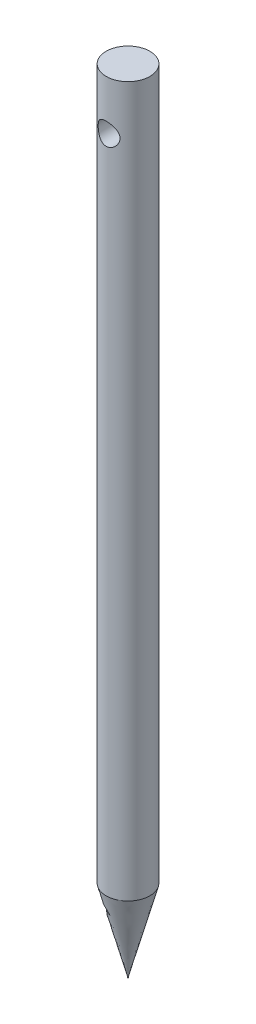
ISO-10303-21;
HEADER;
FILE_DESCRIPTION(('STEP AP214'),'2;1');
FILE_NAME('part.step','',(''),(''),'','','');
FILE_SCHEMA(('AUTOMOTIVE_DESIGN { 1 0 10303 214 1 1 1 1 }'));
ENDSEC;
DATA;
#1=APPLICATION_CONTEXT('core data for automotive mechanical design processes');
#2=APPLICATION_PROTOCOL_DEFINITION('international standard','automotive_design',2000,#1);
#3=PRODUCT_CONTEXT('',#1,'mechanical');
#4=PRODUCT('Part','Part','',(#3));
#5=PRODUCT_RELATED_PRODUCT_CATEGORY('part','',(#4));
#6=PRODUCT_DEFINITION_FORMATION('','',#4);
#7=PRODUCT_DEFINITION_CONTEXT('part definition',#1,'design');
#8=PRODUCT_DEFINITION('design','',#6,#7);
#9=PRODUCT_DEFINITION_SHAPE('','',#8);
#10=(LENGTH_UNIT() NAMED_UNIT(*) SI_UNIT(.MILLI.,.METRE.));
#11=(NAMED_UNIT(*) PLANE_ANGLE_UNIT() SI_UNIT($,.RADIAN.));
#12=(NAMED_UNIT(*) SI_UNIT($,.STERADIAN.) SOLID_ANGLE_UNIT());
#13=UNCERTAINTY_MEASURE_WITH_UNIT(LENGTH_MEASURE(1.E-05),#10,'distance_accuracy_value','');
#14=(GEOMETRIC_REPRESENTATION_CONTEXT(3) GLOBAL_UNCERTAINTY_ASSIGNED_CONTEXT((#13)) GLOBAL_UNIT_ASSIGNED_CONTEXT((#10,
#11,#12)) REPRESENTATION_CONTEXT('',''));
#15=CARTESIAN_POINT('',(0.,0.,0.));
#16=DIRECTION('',(0.,0.,1.));
#17=DIRECTION('',(1.,0.,0.));
#18=AXIS2_PLACEMENT_3D('',#15,#16,#17);
#19=CARTESIAN_POINT('',(0.,129.988767867344,0.));
#20=DIRECTION('',(0.,-1.,0.));
#21=DIRECTION('',(0.,0.,-1.));
#22=AXIS2_PLACEMENT_3D('',#19,#20,#21);
#23=CYLINDRICAL_SURFACE('',#22,4.);
#24=CARTESIAN_POINT('',(0.,122.894404614433,-4.));
#25=CARTESIAN_POINT('',(-0.105143925902467,122.894398009799,-3.99999426810082));
#26=CARTESIAN_POINT('',(-0.210413199395125,122.886064468191,-3.99580982039513));
#27=CARTESIAN_POINT('',(-0.417840470537792,122.85309885375,-3.97948312074314));
#28=CARTESIAN_POINT('',(-0.519992173427258,122.828435828437,-3.96732575657839));
#29=CARTESIAN_POINT('',(-0.717867089760897,122.7640169972,-3.93632558806751));
#30=CARTESIAN_POINT('',(-0.813613605878293,122.724319845937,-3.91750878355075));
#31=CARTESIAN_POINT('',(-0.996945233613197,122.631263371703,-3.87491553031523));
#32=CARTESIAN_POINT('',(-1.08453098798012,122.577905125935,-3.85113947267051));
#33=CARTESIAN_POINT('',(-1.25501563552382,122.455370115462,-3.79912516516124));
#34=CARTESIAN_POINT('',(-1.33731042224422,122.385431655954,-3.77070398255074));
#35=CARTESIAN_POINT('',(-1.48955888973397,122.233361655939,-3.71319940493486));
#36=CARTESIAN_POINT('',(-1.55950316621354,122.151220910888,-3.68411552418069));
#37=CARTESIAN_POINT('',(-1.69050400090056,121.969437915386,-3.62597902394695));
#38=CARTESIAN_POINT('',(-1.75045067110328,121.868932417741,-3.59710373940264));
#39=CARTESIAN_POINT('',(-1.85233645378139,121.657669942461,-3.54571957544641));
#40=CARTESIAN_POINT('',(-1.89428842993267,121.546920356987,-3.52320615213979));
#41=CARTESIAN_POINT('',(-1.95626488437718,121.325074403589,-3.48915734075617));
#42=CARTESIAN_POINT('',(-1.97745171416088,121.214395710298,-3.47704543167427));
#43=CARTESIAN_POINT('',(-2.00085398661769,120.990446938874,-3.46363779897055));
#44=CARTESIAN_POINT('',(-2.00308817674615,120.877179532691,-3.46233138686576));
#45=CARTESIAN_POINT('',(-1.98937457434459,120.665832565802,-3.47021860514497));
#46=CARTESIAN_POINT('',(-1.97556911907365,120.567556551987,-3.47817527324027));
#47=CARTESIAN_POINT('',(-1.93387969811387,120.374960795687,-3.501524574677));
#48=CARTESIAN_POINT('',(-1.9059912477953,120.280642323822,-3.51691957663553));
#49=CARTESIAN_POINT('',(-1.83641956077201,120.095946349302,-3.55374952825482));
#50=CARTESIAN_POINT('',(-1.79443013423199,120.005711816861,-3.57531681327997));
#51=CARTESIAN_POINT('',(-1.69808337533601,119.833136029253,-3.62206808562807));
#52=CARTESIAN_POINT('',(-1.64372048762494,119.750798343233,-3.64725369560381));
#53=CARTESIAN_POINT('',(-1.51613210982558,119.585362108947,-3.70226315806572));
#54=CARTESIAN_POINT('',(-1.44138891673857,119.503490867281,-3.73227020473492));
#55=CARTESIAN_POINT('',(-1.27911115748275,119.352933777251,-3.79095246600814));
#56=CARTESIAN_POINT('',(-1.19157051314857,119.284254230365,-3.81962703917602));
#57=CARTESIAN_POINT('',(-1.0010330116637,119.159033292374,-3.87403974565928));
#58=CARTESIAN_POINT('',(-0.897507183198821,119.103203669542,-3.89957968324014));
#59=CARTESIAN_POINT('',(-0.680932430977601,119.010210556347,-3.94315762242484));
#60=CARTESIAN_POINT('',(-0.567891152530564,118.973032244403,-3.96120157887106));
#61=CARTESIAN_POINT('',(-0.345532983321419,118.921453807,-3.98648667482871));
#62=CARTESIAN_POINT('',(-0.236683061096666,118.905422142939,-3.9944987660262));
#63=CARTESIAN_POINT('',(-0.0175591998987147,118.891475152164,-4.00146026918207));
#64=CARTESIAN_POINT('',(0.0927140397398067,118.893551243154,-4.00041397442637));
#65=CARTESIAN_POINT('',(0.302465943971962,118.91481799127,-3.9898238450687));
#66=CARTESIAN_POINT('',(0.402118816099847,118.932669679893,-3.98094491376337));
#67=CARTESIAN_POINT('',(0.59681378460387,118.982880758223,-3.95644342629681));
#68=CARTESIAN_POINT('',(0.691855371382165,119.01524174734,-3.94082012668824));
#69=CARTESIAN_POINT('',(0.877777216899138,119.094401547299,-3.90368502827176));
#70=CARTESIAN_POINT('',(0.968460794011598,119.141586714666,-3.88201763539262));
#71=CARTESIAN_POINT('',(1.14092272339854,119.248619685726,-3.83487948634835));
#72=CARTESIAN_POINT('',(1.22269725955318,119.308472883624,-3.80940711133877));
#73=CARTESIAN_POINT('',(1.38353537857843,119.445925465094,-3.75416442672396));
#74=CARTESIAN_POINT('',(1.46154415563805,119.524690351323,-3.72421769686999));
#75=CARTESIAN_POINT('',(1.60371264223771,119.694254916988,-3.6652478321764));
#76=CARTESIAN_POINT('',(1.66786277142374,119.785062852129,-3.63622534800094));
#77=CARTESIAN_POINT('',(1.78341582895803,119.981691922779,-3.58102384412979));
#78=CARTESIAN_POINT('',(1.83405099160049,120.088027146622,-3.55505059178121));
#79=CARTESIAN_POINT('',(1.91616565186941,120.309424749583,-3.51148144588269));
#80=CARTESIAN_POINT('',(1.94766983173403,120.424475667367,-3.493874764435));
#81=CARTESIAN_POINT('',(1.98772337493374,120.648225060202,-3.47123002051604));
#82=CARTESIAN_POINT('',(1.9981859928109,120.756473121303,-3.4651476693013));
#83=CARTESIAN_POINT('',(2.0013783087524,120.973298748762,-3.46330709283206));
#84=CARTESIAN_POINT('',(1.99411569324648,121.081876151909,-3.4675443925278));
#85=CARTESIAN_POINT('',(1.96385225118662,121.2853716175,-3.48475724102153));
#86=CARTESIAN_POINT('',(1.94241662868607,121.380605554722,-3.49686188965317));
#87=CARTESIAN_POINT('',(1.88635071644883,121.566020853282,-3.52742032375305));
#88=CARTESIAN_POINT('',(1.85171618231985,121.656200578617,-3.54587615139336));
#89=CARTESIAN_POINT('',(1.76763149060114,121.835654316406,-3.58857060729071));
#90=CARTESIAN_POINT('',(1.71734227563141,121.924460418091,-3.61311444791841));
#91=CARTESIAN_POINT('',(1.60430194327479,122.092953686795,-3.6647066326972));
#92=CARTESIAN_POINT('',(1.54154434248313,122.172636075475,-3.69175627591221));
#93=CARTESIAN_POINT('',(1.39640665332275,122.330688579142,-3.74924646316184));
#94=CARTESIAN_POINT('',(1.31256884599452,122.407722819134,-3.77969966613256));
#95=CARTESIAN_POINT('',(1.13230961246639,122.546930581304,-3.83755504519861));
#96=CARTESIAN_POINT('',(1.0358814466104,122.609096093373,-3.8649555725239));
#97=CARTESIAN_POINT('',(0.831863193565896,122.716877339857,-3.91396019133074));
#98=CARTESIAN_POINT('',(0.724199007553465,122.762372952906,-3.93552192987866));
#99=CARTESIAN_POINT('',(0.501484202276178,122.834020949948,-3.97002682597974));
#100=CARTESIAN_POINT('',(0.386455599178206,122.860228308044,-3.98299446726136));
#101=CARTESIAN_POINT('',(0.225203892981795,122.882199436604,-3.99390923826956));
#102=CARTESIAN_POINT('',(0.180323758883133,122.886769896166,-3.99618730680502));
#103=CARTESIAN_POINT('',(0.0903034636101847,122.892873945461,-3.99923393953631));
#104=CARTESIAN_POINT('',(0.0451632952932577,122.894407451373,-4.00000246206762));
#105=CARTESIAN_POINT('',(0.,122.894404614433,-4.));
#106=B_SPLINE_CURVE_WITH_KNOTS('',3,(#24,#25,#26,#27,#28,#29,#30,#31,#32,#33,#34,#35,#36,#37,
#38,#39,#40,#41,#42,#43,#44,#45,#46,#47,#48,#49,#50,#51,#52,#53,#54,#55,#56,#57,#58,#59,#60,#61,
#62,#63,#64,#65,#66,#67,#68,#69,#70,#71,#72,#73,#74,#75,#76,#77,#78,#79,#80,#81,#82,#83,#84,#85,
#86,#87,#88,#89,#90,#91,#92,#93,#94,#95,#96,#97,#98,#99,#100,#101,#102,#103,#104,#105),
.UNSPECIFIED.,.T.,.F.,(4,2,2,2,2,2,2,2,2,2,2,2,2,2,2,2,2,2,2,2,2,2,2,2,2,2,2,2,2,2,2,2,2,2,2,2,
2,2,2,2,4),(0.,0.315248514840584,0.631096299418395,0.945724310984596,1.26032752116313,
1.59396351743619,1.92785247530807,2.28763452861505,2.64715895796562,2.98516024280458,
3.32282714658039,3.62011424818642,3.91749607851357,4.22180480336974,4.52625042520444,
4.86929882667757,5.21251069197373,5.57166044428881,5.93052433824558,6.2596658094269,
6.58865129022951,6.89213813012242,7.19565843261862,7.50785712055796,7.82018901496678,
8.16319221288838,8.50643177230863,8.86629364323451,9.225690238909,9.55058615006094,
9.87534119729356,10.1691586049771,10.463070575767,10.7767291356057,11.0905512228726,
11.4425048551434,11.7946476676249,12.1492802732705,12.502898172423,12.6383056026783,
12.7737167702213),.UNSPECIFIED.);
#107=CARTESIAN_POINT('',(0.,122.894404614433,-4.));
#108=VERTEX_POINT('',#107);
#109=EDGE_CURVE('E44',#108,#108,#106,.T.);
#110=ORIENTED_EDGE('',*,*,#109,.T.);
#111=EDGE_LOOP('',(#110));
#112=FACE_BOUND('',#111,.T.);
#113=CARTESIAN_POINT('',(2.,120.894404614433,3.46410161513775));
#114=CARTESIAN_POINT('',(1.99999158748781,120.790191408959,3.46411185715888));
#115=CARTESIAN_POINT('',(1.99179963610437,120.685842437899,3.46887633544978));
#116=CARTESIAN_POINT('',(1.95944672580053,120.480349437202,3.48724701669072));
#117=CARTESIAN_POINT('',(1.93525221095662,120.379212611185,3.50087179788183));
#118=CARTESIAN_POINT('',(1.8721998159803,120.183501457986,3.53498701490001));
#119=CARTESIAN_POINT('',(1.83341988295963,120.088895355584,3.55544089069169));
#120=CARTESIAN_POINT('',(1.74253507245138,119.907556163957,3.60085327291133));
#121=CARTESIAN_POINT('',(1.69042947410139,119.820823500996,3.62581202301253));
#122=CARTESIAN_POINT('',(1.569333074538,119.6497931713,3.67993738819289));
#123=CARTESIAN_POINT('',(1.49930407053533,119.566286346841,3.70928127465103));
#124=CARTESIAN_POINT('',(1.34650761698202,119.411587833862,3.76743965382121));
#125=CARTESIAN_POINT('',(1.26373385204841,119.340402288229,3.79625387610258));
#126=CARTESIAN_POINT('',(1.08097912631265,119.207670313244,3.85242953961661));
#127=CARTESIAN_POINT('',(0.980214377887148,119.14709707901,3.87956212851245));
#128=CARTESIAN_POINT('',(0.76831405333691,119.044122907646,3.92701512184167));
#129=CARTESIAN_POINT('',(0.65718507631198,119.001710502082,3.94733982363631));
#130=CARTESIAN_POINT('',(0.436089887818815,118.939395291902,3.97760922492053));
#131=CARTESIAN_POINT('',(0.326603580968784,118.918105561741,3.9881896044274));
#132=CARTESIAN_POINT('',(0.10514125740454,118.894072377064,4.00015167691179));
#133=CARTESIAN_POINT('',(-0.00683321168520671,118.891317700837,4.00153893568935));
#134=CARTESIAN_POINT('',(-0.219665048849571,118.903897962378,3.99525963833124));
#135=CARTESIAN_POINT('',(-0.320642398354137,118.917680645477,3.98836991784381));
#136=CARTESIAN_POINT('',(-0.518627543836087,118.960166302241,3.96748490519435));
#137=CARTESIAN_POINT('',(-0.6156350421877,118.988870392385,3.95348908132771));
#138=CARTESIAN_POINT('',(-0.804618783139259,119.060569746613,3.91943166575325));
#139=CARTESIAN_POINT('',(-0.896506847030398,119.103757240777,3.89928883058403));
#140=CARTESIAN_POINT('',(-1.07195360302662,119.202931446836,3.8547529197337));
#141=CARTESIAN_POINT('',(-1.15550929767728,119.258922741038,3.83035832314967));
#142=CARTESIAN_POINT('',(-1.3203473217964,119.388195317499,3.7768878879846));
#143=CARTESIAN_POINT('',(-1.40066815005873,119.462610671085,3.7475875199635));
#144=CARTESIAN_POINT('',(-1.54820874059556,119.623584064293,3.68908681173623));
#145=CARTESIAN_POINT('',(-1.61541842314846,119.710151358981,3.65988656531258));
#146=CARTESIAN_POINT('',(-1.73901066928442,119.899700999281,3.6028831218497));
#147=CARTESIAN_POINT('',(-1.7944346299561,120.003376660541,3.57528639981415));
#148=CARTESIAN_POINT('',(-1.88663822600246,120.220279957151,3.52750900557152));
#149=CARTESIAN_POINT('',(-1.92343731642178,120.333497480468,3.50732060092135));
#150=CARTESIAN_POINT('',(-1.97436042205008,120.556833636999,3.47889271634069));
#151=CARTESIAN_POINT('',(-1.99005024423995,120.66648685252,3.46983311696993));
#152=CARTESIAN_POINT('',(-2.00303389322285,120.887207297466,3.46235838723219));
#153=CARTESIAN_POINT('',(-2.00034071463005,120.998273472673,3.46393573778623));
#154=CARTESIAN_POINT('',(-1.97807208668793,121.20571245159,3.4766867308117));
#155=CARTESIAN_POINT('',(-1.96037563342493,121.302363516649,3.48679175013308));
#156=CARTESIAN_POINT('',(-1.91139256926489,121.491140186975,3.51388043102682));
#157=CARTESIAN_POINT('',(-1.88010155724726,121.583264315926,3.53086632010068));
#158=CARTESIAN_POINT('',(-1.80329517720973,121.765227276238,3.57072444159313));
#159=CARTESIAN_POINT('',(-1.7571881273853,121.854762648139,3.59383286486125));
#160=CARTESIAN_POINT('',(-1.65257412803176,122.025343157512,3.643122389945));
#161=CARTESIAN_POINT('',(-1.59406080866499,122.106383901464,3.66930506710298));
#162=CARTESIAN_POINT('',(-1.45767433439708,122.268362149476,3.72575996912669));
#163=CARTESIAN_POINT('',(-1.37829054462746,122.347998915851,3.75613166308566));
#164=CARTESIAN_POINT('',(-1.20680899079902,122.493229090438,3.81468469955797));
#165=CARTESIAN_POINT('',(-1.1147069493199,122.55881775496,3.84286530015464));
#166=CARTESIAN_POINT('',(-0.917070725108053,122.675552066266,3.89482723381868));
#167=CARTESIAN_POINT('',(-0.81124619511249,122.7262708506,3.91847283343884));
#168=CARTESIAN_POINT('',(-0.591044729317862,122.808680422403,3.95766709918776));
#169=CARTESIAN_POINT('',(-0.47667540291765,122.840387918117,3.97322287353397));
#170=CARTESIAN_POINT('',(-0.253959364539763,122.881141741918,3.99335016363174));
#171=CARTESIAN_POINT('',(-0.1460228872683,122.892000363097,3.9987985581427));
#172=CARTESIAN_POINT('',(0.070251971469944,122.896091148429,4.00084260752374));
#173=CARTESIAN_POINT('',(0.178590198981612,122.889329482962,3.99744136141634));
#174=CARTESIAN_POINT('',(0.385075986136855,122.859571790117,3.98267937668509));
#175=CARTESIAN_POINT('',(0.483424641057412,122.837674877124,3.97185789309443));
#176=CARTESIAN_POINT('',(0.674891898931558,122.779750654626,3.94384187353387));
#177=CARTESIAN_POINT('',(0.768009749669768,122.743721318726,3.92664642364424));
#178=CARTESIAN_POINT('',(0.950846833596738,122.656950359442,3.88651861393181));
#179=CARTESIAN_POINT('',(1.04025036572289,122.605645394681,3.86337234005404));
#180=CARTESIAN_POINT('',(1.20954920326828,122.490489326315,3.81376266676027));
#181=CARTESIAN_POINT('',(1.28944011444318,122.426632460331,3.78729774583428));
#182=CARTESIAN_POINT('',(1.44582833859495,122.280807978874,3.73057218840582));
#183=CARTESIAN_POINT('',(1.52119665879199,122.197670433633,3.70019591726075));
#184=CARTESIAN_POINT('',(1.65732528394006,122.019512386127,3.64126158628571));
#185=CARTESIAN_POINT('',(1.71807266521244,121.924481483072,3.61270515130784));
#186=CARTESIAN_POINT('',(1.82486714716811,121.721095720303,3.55999186256751));
#187=CARTESIAN_POINT('',(1.87038902381914,121.612414703698,3.53600256268535));
#188=CARTESIAN_POINT('',(1.92395929504801,121.443826494802,3.5069621813237));
#189=CARTESIAN_POINT('',(1.93935666147967,121.386756793842,3.49844389329401));
#190=CARTESIAN_POINT('',(1.96508069805043,121.271172056933,3.48406059323535));
#191=CARTESIAN_POINT('',(1.97541091343283,121.212658061679,3.47819372636051));
#192=CARTESIAN_POINT('',(1.9887293296122,121.110803825186,3.47059023668758));
#193=CARTESIAN_POINT('',(1.99295091983786,121.067671557183,3.46816389731816));
#194=CARTESIAN_POINT('',(1.99858810035606,120.98116892134,3.46491740045177));
#195=CARTESIAN_POINT('',(2.00000350293331,120.937798537766,3.46409735040492));
#196=CARTESIAN_POINT('',(2.,120.894404614433,3.46410161513775));
#197=B_SPLINE_CURVE_WITH_KNOTS('',3,(#113,#114,#115,#116,#117,#118,#119,#120,#121,#122,#123,
#124,#125,#126,#127,#128,#129,#130,#131,#132,#133,#134,#135,#136,#137,#138,#139,#140,#141,#142,
#143,#144,#145,#146,#147,#148,#149,#150,#151,#152,#153,#154,#155,#156,#157,#158,#159,#160,#161,
#162,#163,#164,#165,#166,#167,#168,#169,#170,#171,#172,#173,#174,#175,#176,#177,#178,#179,#180,
#181,#182,#183,#184,#185,#186,#187,#188,#189,#190,#191,#192,#193,#194,#195,#196),.UNSPECIFIED.,
.T.,.F.,(4,2,2,2,2,2,2,2,2,2,2,2,2,2,2,2,2,2,2,2,2,2,2,2,2,2,2,2,2,2,2,2,2,2,2,2,2,2,2,2,2,4),
(0.,0.312464245189433,0.62558578564961,0.937057191861541,1.24854545093096,1.58572462503713,
1.92307142172809,2.28315784481594,2.64301653931849,2.97726969939937,3.31132047376146,
3.61632194973143,3.92134625038977,4.2305906946636,4.53994598704611,4.87854382917848,
5.21740096495904,5.57777683462963,5.93777548427476,6.26924581712489,6.60048186380811,
6.89548366852118,7.19058104876194,7.49934592816241,7.80826972444162,8.15613487165295,
8.50411729960472,8.86128362829999,9.2181355962161,9.54224540783041,9.8662417359201,
10.1688884974705,10.4715786702809,10.7872150144301,11.102996602055,11.450204837042,
11.7977188569437,12.1562149808128,12.3351395323571,12.5139387197526,12.6440387634036,
12.7741475095882),.UNSPECIFIED.);
#198=CARTESIAN_POINT('',(2.,120.894404614433,3.46410161513775));
#199=VERTEX_POINT('',#198);
#200=EDGE_CURVE('E64',#199,#199,#197,.T.);
#201=ORIENTED_EDGE('',*,*,#200,.T.);
#202=EDGE_LOOP('',(#201));
#203=FACE_BOUND('',#202,.T.);
#204=CARTESIAN_POINT('',(0.,129.988767867344,0.));
#205=DIRECTION('',(0.,1.,0.));
#206=DIRECTION('',(0.,0.,1.));
#207=AXIS2_PLACEMENT_3D('',#204,#205,#206);
#208=CIRCLE('',#207,4.);
#209=CARTESIAN_POINT('',(0.,129.988767867344,4.));
#210=VERTEX_POINT('',#209);
#211=EDGE_CURVE('E11',#210,#210,#208,.T.);
#212=ORIENTED_EDGE('',*,*,#211,.F.);
#213=EDGE_LOOP('',(#212));
#214=FACE_BOUND('',#213,.T.);
#215=CARTESIAN_POINT('',(0.,0.,0.));
#216=DIRECTION('',(0.,1.,0.));
#217=DIRECTION('',(0.,0.,1.));
#218=AXIS2_PLACEMENT_3D('',#215,#216,#217);
#219=CIRCLE('',#218,4.);
#220=CARTESIAN_POINT('',(3.96556039885036,0.,0.523765904837037));
#221=VERTEX_POINT('',#220);
#222=EDGE_CURVE('E53',#221,#221,#219,.F.);
#223=ORIENTED_EDGE('',*,*,#222,.F.);
#224=EDGE_LOOP('',(#223));
#225=FACE_BOUND('',#224,.T.);
#226=ADVANCED_FACE('F40',(#112,#203,#214,#225),#23,.T.);
#227=CARTESIAN_POINT('',(0.,129.988767867344,0.));
#228=DIRECTION('',(0.,1.,0.));
#229=DIRECTION('',(0.,0.,1.));
#230=AXIS2_PLACEMENT_3D('',#227,#228,#229);
#231=PLANE('',#230);
#232=ORIENTED_EDGE('',*,*,#211,.T.);
#233=EDGE_LOOP('',(#232));
#234=FACE_BOUND('',#233,.T.);
#235=ADVANCED_FACE('F81',(#234),#231,.T.);
#236=CARTESIAN_POINT('',(0.,-15.,0.));
#237=DIRECTION('',(0.,-1.,0.));
#238=DIRECTION('',(0.,0.,-1.));
#239=AXIS2_PLACEMENT_3D('',#236,#237,#238);
#240=PLANE('',#239);
#241=CARTESIAN_POINT('',(0.,-15.,0.));
#242=DIRECTION('',(0.,-1.,0.));
#243=DIRECTION('',(0.,0.,-1.));
#244=AXIS2_PLACEMENT_3D('',#241,#242,#243);
#245=CIRCLE('',#244,0.0499999999999999);
#246=CARTESIAN_POINT('',(0.,-15.,-0.049999999999999));
#247=VERTEX_POINT('',#246);
#248=EDGE_CURVE('E59',#247,#247,#245,.T.);
#249=ORIENTED_EDGE('',*,*,#248,.T.);
#250=EDGE_LOOP('',(#249));
#251=FACE_BOUND('',#250,.T.);
#252=ADVANCED_FACE('F76',(#251),#240,.T.);
#253=CARTESIAN_POINT('',(0.,-15.,-0.049999999999999));
#254=CARTESIAN_POINT('',(3.96556039885036,0.,0.523765904837037));
#255=CARTESIAN_POINT('',(-0.0999999999999998,-15.,-0.049999999999999));
#256=CARTESIAN_POINT('',(5.01309220852444,0.,-7.40735489286369));
#257=CARTESIAN_POINT('',(-0.0999999999999998,-15.,0.0500000000000008));
#258=CARTESIAN_POINT('',(-2.91802858917629,0.,-8.45488670253776));
#259=CARTESIAN_POINT('',(0.,-15.,0.0500000000000008));
#260=CARTESIAN_POINT('',(-3.96556039885036,0.,-0.523765904837036));
#261=CARTESIAN_POINT('',(0.0999999999999998,-15.,0.0500000000000008));
#262=CARTESIAN_POINT('',(-5.01309220852443,0.,7.40735489286369));
#263=CARTESIAN_POINT('',(0.0999999999999998,-15.,-0.049999999999999));
#264=CARTESIAN_POINT('',(2.91802858917629,0.,8.45488670253776));
#265=CARTESIAN_POINT('',(0.,-15.,-0.049999999999999));
#266=CARTESIAN_POINT('',(3.96556039885036,0.,0.523765904837037));
#267=(BOUNDED_SURFACE() B_SPLINE_SURFACE(3,1,((#253,#254),(#255,#256),(#257,#258),(#259,#260),
(#261,#262),(#263,#264),(#265,#266)),.UNSPECIFIED.,.T.,.F.,.F.) B_SPLINE_SURFACE_WITH_KNOTS((4,
3,4),(2,2),(0.,0.5,1.),(0.,1.),
.UNSPECIFIED.) GEOMETRIC_REPRESENTATION_ITEM() RATIONAL_B_SPLINE_SURFACE(((1.,1.),
(0.333333333333333,0.333333333333333),(0.333333333333333,0.333333333333333),(1.,1.),
(0.333333333333333,0.333333333333333),(0.333333333333333,0.333333333333333),(1.,1.))) REPRESENTATION_ITEM('') SURFACE());
#268=CARTESIAN_POINT('',(0.,-15.,-0.049999999999999));
#269=CARTESIAN_POINT('',(0.041307920821358,-14.84375,-0.0440232718246132));
#270=CARTESIAN_POINT('',(0.0826158416427159,-14.6875,-0.0380465436492274));
#271=CARTESIAN_POINT('',(0.165231683285432,-14.375,-0.0260930872984558));
#272=CARTESIAN_POINT('',(0.20653960410679,-14.21875,-0.0201163591230701));
#273=CARTESIAN_POINT('',(0.289155445749505,-13.90625,-0.00816290277229847));
#274=CARTESIAN_POINT('',(0.330463366570864,-13.75,-0.00218617459691267));
#275=CARTESIAN_POINT('',(0.413079208213579,-13.4375,0.00976728175385892));
#276=CARTESIAN_POINT('',(0.454387129034937,-13.28125,0.0157440099292447));
#277=CARTESIAN_POINT('',(0.537002970677653,-12.96875,0.0276974662800163));
#278=CARTESIAN_POINT('',(0.578310891499011,-12.8125,0.033674194455402));
#279=CARTESIAN_POINT('',(0.660926733141727,-12.5,0.0456276508061736));
#280=CARTESIAN_POINT('',(0.702234653963085,-12.34375,0.0516043789815594));
#281=CARTESIAN_POINT('',(0.784850495605801,-12.03125,0.063557835332331));
#282=CARTESIAN_POINT('',(0.826158416427159,-11.875,0.0695345635077168));
#283=CARTESIAN_POINT('',(0.908774258069874,-11.5625,0.0814880198584884));
#284=CARTESIAN_POINT('',(0.950082178891232,-11.40625,0.0874647480338742));
#285=CARTESIAN_POINT('',(1.03269802053395,-11.09375,0.0994182043846458));
#286=CARTESIAN_POINT('',(1.07400594135531,-10.9375,0.105394932560032));
#287=CARTESIAN_POINT('',(1.15662178299802,-10.625,0.117348388910803));
#288=CARTESIAN_POINT('',(1.19792970381938,-10.46875,0.123325117086189));
#289=CARTESIAN_POINT('',(1.2805455454621,-10.15625,0.13527857343696));
#290=CARTESIAN_POINT('',(1.32185346628345,-10.,0.141255301612346));
#291=CARTESIAN_POINT('',(1.40446930792617,-9.6875,0.153208757963118));
#292=CARTESIAN_POINT('',(1.44577722874753,-9.53125,0.159185486138504));
#293=CARTESIAN_POINT('',(1.52839307039024,-9.21875,0.171138942489275));
#294=CARTESIAN_POINT('',(1.5697009912116,-9.0625,0.177115670664661));
#295=CARTESIAN_POINT('',(1.65231683285432,-8.75,0.189069127015433));
#296=CARTESIAN_POINT('',(1.69362475367568,-8.59375,0.195045855190818));
#297=CARTESIAN_POINT('',(1.77624059531839,-8.28125,0.20699931154159));
#298=CARTESIAN_POINT('',(1.81754851613975,-8.125,0.212976039716976));
#299=CARTESIAN_POINT('',(1.90016435778246,-7.8125,0.224929496067747));
#300=CARTESIAN_POINT('',(1.94147227860382,-7.65625,0.230906224243133));
#301=CARTESIAN_POINT('',(2.02408812024654,-7.34375,0.242859680593905));
#302=CARTESIAN_POINT('',(2.0653960410679,-7.1875,0.248836408769291));
#303=CARTESIAN_POINT('',(2.14801188271061,-6.875,0.260789865120062));
#304=CARTESIAN_POINT('',(2.18931980353197,-6.71875,0.266766593295448));
#305=CARTESIAN_POINT('',(2.27193564517469,-6.40625,0.278720049646219));
#306=CARTESIAN_POINT('',(2.31324356599604,-6.25,0.284696777821605));
#307=CARTESIAN_POINT('',(2.39585940763876,-5.9375,0.296650234172377));
#308=CARTESIAN_POINT('',(2.43716732846012,-5.78125,0.302626962347763));
#309=CARTESIAN_POINT('',(2.51978317010283,-5.46875,0.314580418698534));
#310=CARTESIAN_POINT('',(2.56109109092419,-5.3125,0.32055714687392));
#311=CARTESIAN_POINT('',(2.64370693256691,-5.,0.332510603224692));
#312=CARTESIAN_POINT('',(2.68501485338827,-4.84375,0.338487331400077));
#313=CARTESIAN_POINT('',(2.76763069503098,-4.53125,0.350440787750849));
#314=CARTESIAN_POINT('',(2.80893861585234,-4.375,0.356417515926235));
#315=CARTESIAN_POINT('',(2.89155445749506,-4.0625,0.368370972277006));
#316=CARTESIAN_POINT('',(2.93286237831641,-3.90625,0.374347700452392));
#317=CARTESIAN_POINT('',(3.01547821995913,-3.59375,0.386301156803164));
#318=CARTESIAN_POINT('',(3.05678614078049,-3.4375,0.392277884978549));
#319=CARTESIAN_POINT('',(3.1394019824232,-3.125,0.404231341329321));
#320=CARTESIAN_POINT('',(3.18070990324456,-2.96875,0.410208069504707));
#321=CARTESIAN_POINT('',(3.26332574488728,-2.65625,0.422161525855478));
#322=CARTESIAN_POINT('',(3.30463366570863,-2.5,0.428138254030864));
#323=CARTESIAN_POINT('',(3.38724950735135,-2.1875,0.440091710381636));
#324=CARTESIAN_POINT('',(3.42855742817271,-2.03125,0.446068438557022));
#325=CARTESIAN_POINT('',(3.51117326981542,-1.71875,0.458021894907793));
#326=CARTESIAN_POINT('',(3.55248119063678,-1.5625,0.463998623083179));
#327=CARTESIAN_POINT('',(3.6350970322795,-1.25,0.47595207943395));
#328=CARTESIAN_POINT('',(3.67640495310086,-1.09375,0.481928807609336));
#329=CARTESIAN_POINT('',(3.75902079474357,-0.78125,0.493882263960108));
#330=CARTESIAN_POINT('',(3.80032871556493,-0.625,0.499858992135494));
#331=CARTESIAN_POINT('',(3.88294455720765,-0.3125,0.511812448486265));
#332=CARTESIAN_POINT('',(3.924252478029,-0.15625,0.517789176661651));
#333=CARTESIAN_POINT('',(3.96556039885036,0.,0.523765904837037));
#334=B_SPLINE_CURVE_WITH_KNOTS('',3,(#268,#269,#270,#271,#272,#273,#274,#275,#276,#277,#278,
#279,#280,#281,#282,#283,#284,#285,#286,#287,#288,#289,#290,#291,#292,#293,#294,#295,#296,#297,
#298,#299,#300,#301,#302,#303,#304,#305,#306,#307,#308,#309,#310,#311,#312,#313,#314,#315,#316,
#317,#318,#319,#320,#321,#322,#323,#324,#325,#326,#327,#328,#329,#330,#331,#332,#333),
.UNSPECIFIED.,.F.,.F.,(4,2,2,2,2,2,2,2,2,2,2,2,2,2,2,2,2,2,2,2,2,2,2,2,2,2,2,2,2,2,2,2,4),(0.,
0.485185689113348,0.970371378226697,1.45555706734004,1.94074275645339,2.42592844556674,
2.91111413468009,3.39629982379343,3.88148551290678,4.36667120202013,4.85185689113348,
5.33704258024683,5.82222826936017,6.30741395847352,6.79259964758687,7.27778533670022,
7.76297102581356,8.24815671492691,8.73334240404026,9.21852809315361,9.70371378226696,
10.1888994713803,10.6740851604937,11.159270849607,11.6444565387203,12.1296422278337,
12.614827916947,13.1000136060604,13.5851992951737,14.0703849842871,14.5555706734004,
15.0407563625138,15.5259420516271),.UNSPECIFIED.);
#335=EDGE_CURVE('BSEAM74',#247,#221,#334,.T.);
#336=ORIENTED_EDGE('',*,*,#248,.F.);
#337=ORIENTED_EDGE('',*,*,#222,.T.);
#338=ORIENTED_EDGE('',*,*,#335,.T.);
#339=ORIENTED_EDGE('',*,*,#335,.F.);
#340=EDGE_LOOP('',(#336,#338,#337,#339));
#341=FACE_BOUND('',#340,.T.);
#342=ADVANCED_FACE('F74',(#341),#267,.T.);
#343=CARTESIAN_POINT('',(0.,120.894404614433,-19.5));
#344=DIRECTION('',(0.,0.,1.));
#345=DIRECTION('',(1.,0.,0.));
#346=AXIS2_PLACEMENT_3D('',#343,#344,#345);
#347=CYLINDRICAL_SURFACE('',#346,2.);
#348=ORIENTED_EDGE('',*,*,#200,.F.);
#349=EDGE_LOOP('',(#348));
#350=FACE_BOUND('',#349,.T.);
#351=ORIENTED_EDGE('',*,*,#109,.F.);
#352=EDGE_LOOP('',(#351));
#353=FACE_BOUND('',#352,.T.);
#354=ADVANCED_FACE('F70',(#350,#353),#347,.F.);
#355=CLOSED_SHELL('',(#226,#235,#252,#342,#354));
#356=MANIFOLD_SOLID_BREP('B2',#355);
#357=ADVANCED_BREP_SHAPE_REPRESENTATION('',(#18,#356),#14);
#358=SHAPE_DEFINITION_REPRESENTATION(#9,#357);
ENDSEC;
END-ISO-10303-21;
